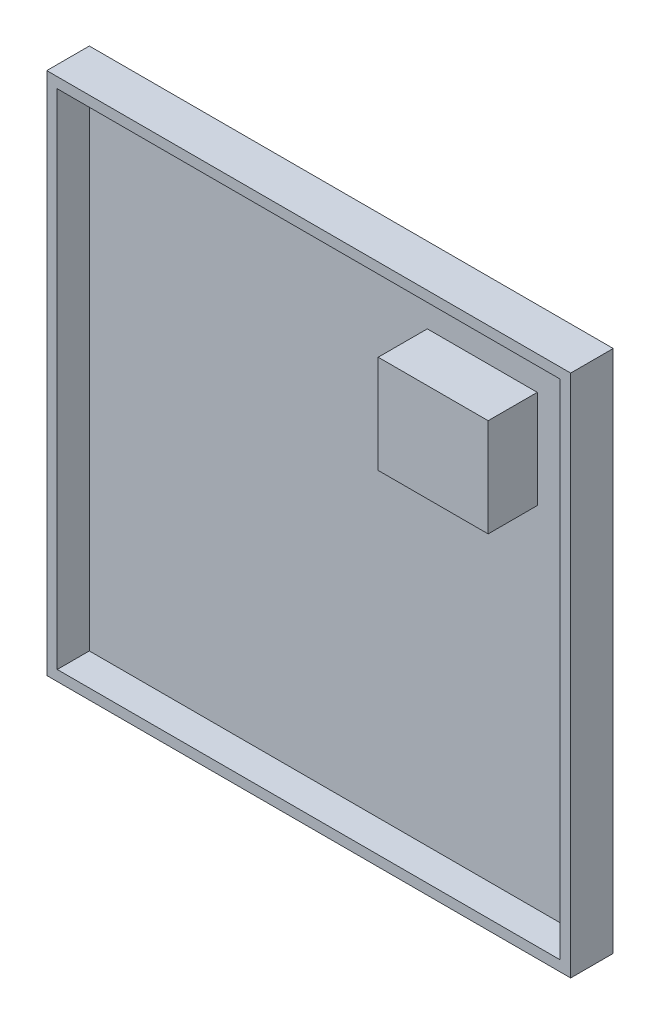
ISO-10303-21;
HEADER;
FILE_DESCRIPTION(('STEP AP214'),'2;1');
FILE_NAME('part.step','',(''),(''),'','','');
FILE_SCHEMA(('AUTOMOTIVE_DESIGN { 1 0 10303 214 1 1 1 1 }'));
ENDSEC;
DATA;
#1=APPLICATION_CONTEXT('core data for automotive mechanical design processes');
#2=APPLICATION_PROTOCOL_DEFINITION('international standard','automotive_design',2000,#1);
#3=PRODUCT_CONTEXT('',#1,'mechanical');
#4=PRODUCT('Part','Part','',(#3));
#5=PRODUCT_RELATED_PRODUCT_CATEGORY('part','',(#4));
#6=PRODUCT_DEFINITION_FORMATION('','',#4);
#7=PRODUCT_DEFINITION_CONTEXT('part definition',#1,'design');
#8=PRODUCT_DEFINITION('design','',#6,#7);
#9=PRODUCT_DEFINITION_SHAPE('','',#8);
#10=(LENGTH_UNIT() NAMED_UNIT(*) SI_UNIT(.MILLI.,.METRE.));
#11=(NAMED_UNIT(*) PLANE_ANGLE_UNIT() SI_UNIT($,.RADIAN.));
#12=(NAMED_UNIT(*) SI_UNIT($,.STERADIAN.) SOLID_ANGLE_UNIT());
#13=UNCERTAINTY_MEASURE_WITH_UNIT(LENGTH_MEASURE(1.E-05),#10,'distance_accuracy_value','');
#14=(GEOMETRIC_REPRESENTATION_CONTEXT(3) GLOBAL_UNCERTAINTY_ASSIGNED_CONTEXT((#13)) GLOBAL_UNIT_ASSIGNED_CONTEXT((#10,
#11,#12)) REPRESENTATION_CONTEXT('',''));
#15=CARTESIAN_POINT('',(0.,0.,0.));
#16=DIRECTION('',(0.,0.,1.));
#17=DIRECTION('',(1.,0.,0.));
#18=AXIS2_PLACEMENT_3D('',#15,#16,#17);
#19=CARTESIAN_POINT('',(0.,0.,2.032));
#20=DIRECTION('',(0.,0.,-1.));
#21=DIRECTION('',(-1.,0.,0.));
#22=AXIS2_PLACEMENT_3D('',#19,#20,#21);
#23=PLANE('',#22);
#24=DIRECTION('',(0.,1.,0.));
#25=VECTOR('',#24,1.);
#26=CARTESIAN_POINT('',(48.768,-48.768,2.03200000000001));
#27=LINE('',#26,#25);
#28=CARTESIAN_POINT('',(48.768,-48.768,2.03200000000001));
#29=VERTEX_POINT('',#28);
#30=CARTESIAN_POINT('',(48.768,48.768,2.03200000000001));
#31=VERTEX_POINT('',#30);
#32=EDGE_CURVE('E229',#29,#31,#27,.T.);
#33=ORIENTED_EDGE('',*,*,#32,.T.);
#34=DIRECTION('',(-1.,0.,0.));
#35=VECTOR('',#34,1.);
#36=CARTESIAN_POINT('',(-48.768,48.768,2.03200000000001));
#37=LINE('',#36,#35);
#38=CARTESIAN_POINT('',(-48.768,48.768,2.03200000000001));
#39=VERTEX_POINT('',#38);
#40=EDGE_CURVE('E217',#31,#39,#37,.T.);
#41=ORIENTED_EDGE('',*,*,#40,.T.);
#42=DIRECTION('',(0.,-1.,0.));
#43=VECTOR('',#42,1.);
#44=CARTESIAN_POINT('',(-48.768,-48.768,2.03200000000001));
#45=LINE('',#44,#43);
#46=CARTESIAN_POINT('',(-48.768,-48.768,2.03200000000001));
#47=VERTEX_POINT('',#46);
#48=EDGE_CURVE('E238',#39,#47,#45,.T.);
#49=ORIENTED_EDGE('',*,*,#48,.T.);
#50=DIRECTION('',(1.,0.,0.));
#51=VECTOR('',#50,1.);
#52=CARTESIAN_POINT('',(-48.768,-48.768,2.03200000000001));
#53=LINE('',#52,#51);
#54=EDGE_CURVE('E234',#47,#29,#53,.T.);
#55=ORIENTED_EDGE('',*,*,#54,.T.);
#56=EDGE_LOOP('',(#33,#41,#49,#55));
#57=FACE_BOUND('',#56,.T.);
#58=DIRECTION('',(0.,1.,0.));
#59=VECTOR('',#58,1.);
#60=CARTESIAN_POINT('',(38.1,19.0836276958304,2.032));
#61=LINE('',#60,#59);
#62=CARTESIAN_POINT('',(38.1,19.0836276958304,2.032));
#63=VERTEX_POINT('',#62);
#64=CARTESIAN_POINT('',(38.1,38.1,2.032));
#65=VERTEX_POINT('',#64);
#66=EDGE_CURVE('E183',#63,#65,#61,.T.);
#67=ORIENTED_EDGE('',*,*,#66,.F.);
#68=DIRECTION('',(1.,0.,0.));
#69=VECTOR('',#68,1.);
#70=CARTESIAN_POINT('',(16.7786128710826,19.0836276958304,2.032));
#71=LINE('',#70,#69);
#72=CARTESIAN_POINT('',(16.7786128710826,19.0836276958304,2.032));
#73=VERTEX_POINT('',#72);
#74=EDGE_CURVE('E189',#73,#63,#71,.T.);
#75=ORIENTED_EDGE('',*,*,#74,.F.);
#76=DIRECTION('',(0.,-1.,0.));
#77=VECTOR('',#76,1.);
#78=CARTESIAN_POINT('',(16.7786128710826,19.0836276958304,2.032));
#79=LINE('',#78,#77);
#80=CARTESIAN_POINT('',(16.7786128710826,38.1,2.032));
#81=VERTEX_POINT('',#80);
#82=EDGE_CURVE('E199',#81,#73,#79,.T.);
#83=ORIENTED_EDGE('',*,*,#82,.F.);
#84=DIRECTION('',(-1.,0.,0.));
#85=VECTOR('',#84,1.);
#86=CARTESIAN_POINT('',(16.7786128710826,38.1,2.032));
#87=LINE('',#86,#85);
#88=EDGE_CURVE('E59',#65,#81,#87,.T.);
#89=ORIENTED_EDGE('',*,*,#88,.F.);
#90=EDGE_LOOP('',(#67,#75,#83,#89));
#91=FACE_BOUND('',#90,.T.);
#92=ADVANCED_FACE('F36',(#57,#91),#23,.F.);
#93=CARTESIAN_POINT('',(50.8,-50.8,8.255));
#94=DIRECTION('',(-1.,0.,0.));
#95=DIRECTION('',(0.,0.,1.));
#96=AXIS2_PLACEMENT_3D('',#93,#94,#95);
#97=PLANE('',#96);
#98=DIRECTION('',(0.,1.,0.));
#99=VECTOR('',#98,1.);
#100=CARTESIAN_POINT('',(50.8,-50.8,0.));
#101=LINE('',#100,#99);
#102=CARTESIAN_POINT('',(50.8,-50.8,0.));
#103=VERTEX_POINT('',#102);
#104=CARTESIAN_POINT('',(50.8,50.8,0.));
#105=VERTEX_POINT('',#104);
#106=EDGE_CURVE('E246',#103,#105,#101,.T.);
#107=ORIENTED_EDGE('',*,*,#106,.T.);
#108=DIRECTION('',(0.,0.,-1.));
#109=VECTOR('',#108,1.);
#110=CARTESIAN_POINT('',(50.8,50.8,8.255));
#111=LINE('',#110,#109);
#112=CARTESIAN_POINT('',(50.8,50.8,8.255));
#113=VERTEX_POINT('',#112);
#114=EDGE_CURVE('E12',#113,#105,#111,.T.);
#115=ORIENTED_EDGE('',*,*,#114,.F.);
#116=DIRECTION('',(0.,1.,0.));
#117=VECTOR('',#116,1.);
#118=CARTESIAN_POINT('',(50.8,-50.8,8.255));
#119=LINE('',#118,#117);
#120=CARTESIAN_POINT('',(50.8,-50.8,8.255));
#121=VERTEX_POINT('',#120);
#122=EDGE_CURVE('E247',#121,#113,#119,.T.);
#123=ORIENTED_EDGE('',*,*,#122,.F.);
#124=DIRECTION('',(0.,0.,-1.));
#125=VECTOR('',#124,1.);
#126=CARTESIAN_POINT('',(50.8,-50.8,8.255));
#127=LINE('',#126,#125);
#128=EDGE_CURVE('E257',#121,#103,#127,.T.);
#129=ORIENTED_EDGE('',*,*,#128,.T.);
#130=EDGE_LOOP('',(#107,#115,#123,#129));
#131=FACE_BOUND('',#130,.T.);
#132=ADVANCED_FACE('F38',(#131),#97,.F.);
#133=CARTESIAN_POINT('',(-50.8,50.8,8.255));
#134=DIRECTION('',(0.,-1.,0.));
#135=DIRECTION('',(0.,0.,-1.));
#136=AXIS2_PLACEMENT_3D('',#133,#134,#135);
#137=PLANE('',#136);
#138=DIRECTION('',(-1.,0.,0.));
#139=VECTOR('',#138,1.);
#140=CARTESIAN_POINT('',(-50.8,50.8,0.));
#141=LINE('',#140,#139);
#142=CARTESIAN_POINT('',(-50.8,50.8,0.));
#143=VERTEX_POINT('',#142);
#144=EDGE_CURVE('E260',#105,#143,#141,.T.);
#145=ORIENTED_EDGE('',*,*,#144,.T.);
#146=DIRECTION('',(0.,0.,-1.));
#147=VECTOR('',#146,1.);
#148=CARTESIAN_POINT('',(-50.8,50.8,8.255));
#149=LINE('',#148,#147);
#150=CARTESIAN_POINT('',(-50.8,50.8,8.255));
#151=VERTEX_POINT('',#150);
#152=EDGE_CURVE('E44',#151,#143,#149,.T.);
#153=ORIENTED_EDGE('',*,*,#152,.F.);
#154=DIRECTION('',(-1.,0.,0.));
#155=VECTOR('',#154,1.);
#156=CARTESIAN_POINT('',(-50.8,50.8,8.255));
#157=LINE('',#156,#155);
#158=EDGE_CURVE('E250',#113,#151,#157,.T.);
#159=ORIENTED_EDGE('',*,*,#158,.F.);
#160=ORIENTED_EDGE('',*,*,#114,.T.);
#161=EDGE_LOOP('',(#145,#153,#159,#160));
#162=FACE_BOUND('',#161,.T.);
#163=ADVANCED_FACE('F288',(#162),#137,.F.);
#164=CARTESIAN_POINT('',(-50.8,-50.8,8.255));
#165=DIRECTION('',(1.,0.,0.));
#166=DIRECTION('',(0.,0.,-1.));
#167=AXIS2_PLACEMENT_3D('',#164,#165,#166);
#168=PLANE('',#167);
#169=DIRECTION('',(0.,-1.,0.));
#170=VECTOR('',#169,1.);
#171=CARTESIAN_POINT('',(-50.8,-50.8,0.));
#172=LINE('',#171,#170);
#173=CARTESIAN_POINT('',(-50.8,-50.8,0.));
#174=VERTEX_POINT('',#173);
#175=EDGE_CURVE('E262',#143,#174,#172,.T.);
#176=ORIENTED_EDGE('',*,*,#175,.T.);
#177=DIRECTION('',(0.,0.,-1.));
#178=VECTOR('',#177,1.);
#179=CARTESIAN_POINT('',(-50.8,-50.8,8.255));
#180=LINE('',#179,#178);
#181=CARTESIAN_POINT('',(-50.8,-50.8,8.255));
#182=VERTEX_POINT('',#181);
#183=EDGE_CURVE('E267',#182,#174,#180,.T.);
#184=ORIENTED_EDGE('',*,*,#183,.F.);
#185=DIRECTION('',(0.,-1.,0.));
#186=VECTOR('',#185,1.);
#187=CARTESIAN_POINT('',(-50.8,-50.8,8.255));
#188=LINE('',#187,#186);
#189=EDGE_CURVE('E253',#151,#182,#188,.T.);
#190=ORIENTED_EDGE('',*,*,#189,.F.);
#191=ORIENTED_EDGE('',*,*,#152,.T.);
#192=EDGE_LOOP('',(#176,#184,#190,#191));
#193=FACE_BOUND('',#192,.T.);
#194=ADVANCED_FACE('F274',(#193),#168,.F.);
#195=CARTESIAN_POINT('',(-50.8,-50.8,8.255));
#196=DIRECTION('',(0.,1.,0.));
#197=DIRECTION('',(0.,0.,1.));
#198=AXIS2_PLACEMENT_3D('',#195,#196,#197);
#199=PLANE('',#198);
#200=DIRECTION('',(1.,0.,0.));
#201=VECTOR('',#200,1.);
#202=CARTESIAN_POINT('',(-50.8,-50.8,0.));
#203=LINE('',#202,#201);
#204=EDGE_CURVE('E251',#174,#103,#203,.T.);
#205=ORIENTED_EDGE('',*,*,#204,.T.);
#206=ORIENTED_EDGE('',*,*,#128,.F.);
#207=DIRECTION('',(1.,0.,0.));
#208=VECTOR('',#207,1.);
#209=CARTESIAN_POINT('',(-50.8,-50.8,8.255));
#210=LINE('',#209,#208);
#211=EDGE_CURVE('E255',#182,#121,#210,.T.);
#212=ORIENTED_EDGE('',*,*,#211,.F.);
#213=ORIENTED_EDGE('',*,*,#183,.T.);
#214=EDGE_LOOP('',(#205,#206,#212,#213));
#215=FACE_BOUND('',#214,.T.);
#216=ADVANCED_FACE('F281',(#215),#199,.F.);
#217=CARTESIAN_POINT('',(0.,0.,8.255));
#218=DIRECTION('',(0.,0.,-1.));
#219=DIRECTION('',(-1.,0.,0.));
#220=AXIS2_PLACEMENT_3D('',#217,#218,#219);
#221=PLANE('',#220);
#222=DIRECTION('',(0.,-1.,0.));
#223=VECTOR('',#222,1.);
#224=CARTESIAN_POINT('',(-48.768,-48.768,8.255));
#225=LINE('',#224,#223);
#226=CARTESIAN_POINT('',(-48.768,48.768,8.255));
#227=VERTEX_POINT('',#226);
#228=CARTESIAN_POINT('',(-48.768,-48.768,8.255));
#229=VERTEX_POINT('',#228);
#230=EDGE_CURVE('E218',#227,#229,#225,.T.);
#231=ORIENTED_EDGE('',*,*,#230,.F.);
#232=DIRECTION('',(-1.,0.,0.));
#233=VECTOR('',#232,1.);
#234=CARTESIAN_POINT('',(-48.768,48.768,8.255));
#235=LINE('',#234,#233);
#236=CARTESIAN_POINT('',(48.768,48.768,8.255));
#237=VERTEX_POINT('',#236);
#238=EDGE_CURVE('E221',#237,#227,#235,.T.);
#239=ORIENTED_EDGE('',*,*,#238,.F.);
#240=DIRECTION('',(0.,1.,0.));
#241=VECTOR('',#240,1.);
#242=CARTESIAN_POINT('',(48.768,-48.768,8.255));
#243=LINE('',#242,#241);
#244=CARTESIAN_POINT('',(48.768,-48.768,8.255));
#245=VERTEX_POINT('',#244);
#246=EDGE_CURVE('E214',#245,#237,#243,.T.);
#247=ORIENTED_EDGE('',*,*,#246,.F.);
#248=DIRECTION('',(1.,0.,0.));
#249=VECTOR('',#248,1.);
#250=CARTESIAN_POINT('',(-48.768,-48.768,8.255));
#251=LINE('',#250,#249);
#252=EDGE_CURVE('E215',#229,#245,#251,.T.);
#253=ORIENTED_EDGE('',*,*,#252,.F.);
#254=EDGE_LOOP('',(#231,#239,#247,#253));
#255=FACE_BOUND('',#254,.T.);
#256=ORIENTED_EDGE('',*,*,#122,.T.);
#257=ORIENTED_EDGE('',*,*,#158,.T.);
#258=ORIENTED_EDGE('',*,*,#189,.T.);
#259=ORIENTED_EDGE('',*,*,#211,.T.);
#260=EDGE_LOOP('',(#256,#257,#258,#259));
#261=FACE_BOUND('',#260,.T.);
#262=ADVANCED_FACE('F287',(#255,#261),#221,.F.);
#263=CARTESIAN_POINT('',(0.,0.,0.));
#264=DIRECTION('',(0.,0.,-1.));
#265=DIRECTION('',(-1.,0.,0.));
#266=AXIS2_PLACEMENT_3D('',#263,#264,#265);
#267=PLANE('',#266);
#268=DIRECTION('',(0.,1.,0.));
#269=VECTOR('',#268,1.);
#270=CARTESIAN_POINT('',(18.8106128710826,21.1156276958304,0.));
#271=LINE('',#270,#269);
#272=CARTESIAN_POINT('',(18.8106128710826,21.1156276958304,0.));
#273=VERTEX_POINT('',#272);
#274=CARTESIAN_POINT('',(18.8106128710826,36.068,0.));
#275=VERTEX_POINT('',#274);
#276=EDGE_CURVE('E51',#273,#275,#271,.T.);
#277=ORIENTED_EDGE('',*,*,#276,.F.);
#278=DIRECTION('',(-1.,0.,0.));
#279=VECTOR('',#278,1.);
#280=CARTESIAN_POINT('',(18.8106128710826,21.1156276958304,0.));
#281=LINE('',#280,#279);
#282=CARTESIAN_POINT('',(36.068,21.1156276958304,0.));
#283=VERTEX_POINT('',#282);
#284=EDGE_CURVE('E172',#283,#273,#281,.T.);
#285=ORIENTED_EDGE('',*,*,#284,.F.);
#286=DIRECTION('',(0.,-1.,0.));
#287=VECTOR('',#286,1.);
#288=CARTESIAN_POINT('',(36.068,21.1156276958304,0.));
#289=LINE('',#288,#287);
#290=CARTESIAN_POINT('',(36.068,36.068,0.));
#291=VERTEX_POINT('',#290);
#292=EDGE_CURVE('E155',#291,#283,#289,.T.);
#293=ORIENTED_EDGE('',*,*,#292,.F.);
#294=DIRECTION('',(1.,0.,0.));
#295=VECTOR('',#294,1.);
#296=CARTESIAN_POINT('',(18.8106128710826,36.068,0.));
#297=LINE('',#296,#295);
#298=EDGE_CURVE('E165',#275,#291,#297,.T.);
#299=ORIENTED_EDGE('',*,*,#298,.F.);
#300=EDGE_LOOP('',(#277,#285,#293,#299));
#301=FACE_BOUND('',#300,.T.);
#302=ORIENTED_EDGE('',*,*,#106,.F.);
#303=ORIENTED_EDGE('',*,*,#204,.F.);
#304=ORIENTED_EDGE('',*,*,#175,.F.);
#305=ORIENTED_EDGE('',*,*,#144,.F.);
#306=EDGE_LOOP('',(#302,#303,#304,#305));
#307=FACE_BOUND('',#306,.T.);
#308=ADVANCED_FACE('F169',(#301,#307),#267,.T.);
#309=CARTESIAN_POINT('',(-48.768,48.768,-137.936734019622));
#310=DIRECTION('',(0.,1.,0.));
#311=DIRECTION('',(0.,0.,1.));
#312=AXIS2_PLACEMENT_3D('',#309,#310,#311);
#313=PLANE('',#312);
#314=DIRECTION('',(0.,0.,1.));
#315=VECTOR('',#314,1.);
#316=CARTESIAN_POINT('',(48.768,48.768,-137.936734019622));
#317=LINE('',#316,#315);
#318=EDGE_CURVE('E232',#31,#237,#317,.T.);
#319=ORIENTED_EDGE('',*,*,#318,.T.);
#320=ORIENTED_EDGE('',*,*,#238,.T.);
#321=DIRECTION('',(0.,0.,1.));
#322=VECTOR('',#321,1.);
#323=CARTESIAN_POINT('',(-48.768,48.768,-137.936734019622));
#324=LINE('',#323,#322);
#325=EDGE_CURVE('E228',#39,#227,#324,.T.);
#326=ORIENTED_EDGE('',*,*,#325,.F.);
#327=ORIENTED_EDGE('',*,*,#40,.F.);
#328=EDGE_LOOP('',(#319,#320,#326,#327));
#329=FACE_BOUND('',#328,.T.);
#330=ADVANCED_FACE('F302',(#329),#313,.F.);
#331=CARTESIAN_POINT('',(-48.768,-48.768,-137.936734019622));
#332=DIRECTION('',(-1.,0.,0.));
#333=DIRECTION('',(0.,0.,1.));
#334=AXIS2_PLACEMENT_3D('',#331,#332,#333);
#335=PLANE('',#334);
#336=ORIENTED_EDGE('',*,*,#325,.T.);
#337=ORIENTED_EDGE('',*,*,#230,.T.);
#338=DIRECTION('',(0.,0.,1.));
#339=VECTOR('',#338,1.);
#340=CARTESIAN_POINT('',(-48.768,-48.768,-137.936734019622));
#341=LINE('',#340,#339);
#342=EDGE_CURVE('E237',#47,#229,#341,.T.);
#343=ORIENTED_EDGE('',*,*,#342,.F.);
#344=ORIENTED_EDGE('',*,*,#48,.F.);
#345=EDGE_LOOP('',(#336,#337,#343,#344));
#346=FACE_BOUND('',#345,.T.);
#347=ADVANCED_FACE('F330',(#346),#335,.F.);
#348=CARTESIAN_POINT('',(-48.768,-48.768,-137.936734019622));
#349=DIRECTION('',(0.,-1.,0.));
#350=DIRECTION('',(0.,0.,-1.));
#351=AXIS2_PLACEMENT_3D('',#348,#349,#350);
#352=PLANE('',#351);
#353=ORIENTED_EDGE('',*,*,#342,.T.);
#354=ORIENTED_EDGE('',*,*,#252,.T.);
#355=DIRECTION('',(0.,0.,1.));
#356=VECTOR('',#355,1.);
#357=CARTESIAN_POINT('',(48.768,-48.768,-137.936734019622));
#358=LINE('',#357,#356);
#359=EDGE_CURVE('E233',#29,#245,#358,.T.);
#360=ORIENTED_EDGE('',*,*,#359,.F.);
#361=ORIENTED_EDGE('',*,*,#54,.F.);
#362=EDGE_LOOP('',(#353,#354,#360,#361));
#363=FACE_BOUND('',#362,.T.);
#364=ADVANCED_FACE('F337',(#363),#352,.F.);
#365=CARTESIAN_POINT('',(48.768,-48.768,-137.936734019622));
#366=DIRECTION('',(1.,0.,0.));
#367=DIRECTION('',(0.,0.,-1.));
#368=AXIS2_PLACEMENT_3D('',#365,#366,#367);
#369=PLANE('',#368);
#370=ORIENTED_EDGE('',*,*,#359,.T.);
#371=ORIENTED_EDGE('',*,*,#246,.T.);
#372=ORIENTED_EDGE('',*,*,#318,.F.);
#373=ORIENTED_EDGE('',*,*,#32,.F.);
#374=EDGE_LOOP('',(#370,#371,#372,#373));
#375=FACE_BOUND('',#374,.T.);
#376=ADVANCED_FACE('F344',(#375),#369,.F.);
#377=CARTESIAN_POINT('',(38.1,19.0836276958304,11.557));
#378=DIRECTION('',(-1.,0.,0.));
#379=DIRECTION('',(0.,0.,1.));
#380=AXIS2_PLACEMENT_3D('',#377,#378,#379);
#381=PLANE('',#380);
#382=ORIENTED_EDGE('',*,*,#66,.T.);
#383=DIRECTION('',(0.,0.,-1.));
#384=VECTOR('',#383,1.);
#385=CARTESIAN_POINT('',(38.1,38.1,11.557));
#386=LINE('',#385,#384);
#387=CARTESIAN_POINT('',(38.1,38.1,11.557));
#388=VERTEX_POINT('',#387);
#389=EDGE_CURVE('E212',#388,#65,#386,.T.);
#390=ORIENTED_EDGE('',*,*,#389,.F.);
#391=DIRECTION('',(0.,1.,0.));
#392=VECTOR('',#391,1.);
#393=CARTESIAN_POINT('',(38.1,19.0836276958304,11.557));
#394=LINE('',#393,#392);
#395=CARTESIAN_POINT('',(38.1,19.0836276958304,11.557));
#396=VERTEX_POINT('',#395);
#397=EDGE_CURVE('E185',#396,#388,#394,.T.);
#398=ORIENTED_EDGE('',*,*,#397,.F.);
#399=DIRECTION('',(0.,0.,-1.));
#400=VECTOR('',#399,1.);
#401=CARTESIAN_POINT('',(38.1,19.0836276958304,11.557));
#402=LINE('',#401,#400);
#403=EDGE_CURVE('E195',#396,#63,#402,.T.);
#404=ORIENTED_EDGE('',*,*,#403,.T.);
#405=EDGE_LOOP('',(#382,#390,#398,#404));
#406=FACE_BOUND('',#405,.T.);
#407=ADVANCED_FACE('F352',(#406),#381,.F.);
#408=CARTESIAN_POINT('',(16.7786128710826,38.1,11.557));
#409=DIRECTION('',(0.,-1.,0.));
#410=DIRECTION('',(0.,0.,-1.));
#411=AXIS2_PLACEMENT_3D('',#408,#409,#410);
#412=PLANE('',#411);
#413=ORIENTED_EDGE('',*,*,#88,.T.);
#414=DIRECTION('',(0.,0.,-1.));
#415=VECTOR('',#414,1.);
#416=CARTESIAN_POINT('',(16.7786128710826,38.1,11.557));
#417=LINE('',#416,#415);
#418=CARTESIAN_POINT('',(16.7786128710826,38.1,11.557));
#419=VERTEX_POINT('',#418);
#420=EDGE_CURVE('E209',#419,#81,#417,.T.);
#421=ORIENTED_EDGE('',*,*,#420,.F.);
#422=DIRECTION('',(-1.,0.,0.));
#423=VECTOR('',#422,1.);
#424=CARTESIAN_POINT('',(16.7786128710826,38.1,11.557));
#425=LINE('',#424,#423);
#426=EDGE_CURVE('E188',#388,#419,#425,.T.);
#427=ORIENTED_EDGE('',*,*,#426,.F.);
#428=ORIENTED_EDGE('',*,*,#389,.T.);
#429=EDGE_LOOP('',(#413,#421,#427,#428));
#430=FACE_BOUND('',#429,.T.);
#431=ADVANCED_FACE('F360',(#430),#412,.F.);
#432=CARTESIAN_POINT('',(16.7786128710826,19.0836276958304,11.557));
#433=DIRECTION('',(1.,0.,0.));
#434=DIRECTION('',(0.,0.,-1.));
#435=AXIS2_PLACEMENT_3D('',#432,#433,#434);
#436=PLANE('',#435);
#437=ORIENTED_EDGE('',*,*,#82,.T.);
#438=DIRECTION('',(0.,0.,-1.));
#439=VECTOR('',#438,1.);
#440=CARTESIAN_POINT('',(16.7786128710826,19.0836276958304,11.557));
#441=LINE('',#440,#439);
#442=CARTESIAN_POINT('',(16.7786128710826,19.0836276958304,11.557));
#443=VERTEX_POINT('',#442);
#444=EDGE_CURVE('E206',#443,#73,#441,.T.);
#445=ORIENTED_EDGE('',*,*,#444,.F.);
#446=DIRECTION('',(0.,-1.,0.));
#447=VECTOR('',#446,1.);
#448=CARTESIAN_POINT('',(16.7786128710826,19.0836276958304,11.557));
#449=LINE('',#448,#447);
#450=EDGE_CURVE('E191',#419,#443,#449,.T.);
#451=ORIENTED_EDGE('',*,*,#450,.F.);
#452=ORIENTED_EDGE('',*,*,#420,.T.);
#453=EDGE_LOOP('',(#437,#445,#451,#452));
#454=FACE_BOUND('',#453,.T.);
#455=ADVANCED_FACE('F368',(#454),#436,.F.);
#456=CARTESIAN_POINT('',(16.7786128710826,19.0836276958304,11.557));
#457=DIRECTION('',(0.,1.,0.));
#458=DIRECTION('',(0.,0.,1.));
#459=AXIS2_PLACEMENT_3D('',#456,#457,#458);
#460=PLANE('',#459);
#461=ORIENTED_EDGE('',*,*,#74,.T.);
#462=ORIENTED_EDGE('',*,*,#403,.F.);
#463=DIRECTION('',(1.,0.,0.));
#464=VECTOR('',#463,1.);
#465=CARTESIAN_POINT('',(16.7786128710826,19.0836276958304,11.557));
#466=LINE('',#465,#464);
#467=EDGE_CURVE('E193',#443,#396,#466,.T.);
#468=ORIENTED_EDGE('',*,*,#467,.F.);
#469=ORIENTED_EDGE('',*,*,#444,.T.);
#470=EDGE_LOOP('',(#461,#462,#468,#469));
#471=FACE_BOUND('',#470,.T.);
#472=ADVANCED_FACE('F376',(#471),#460,.F.);
#473=CARTESIAN_POINT('',(0.,0.,11.557));
#474=DIRECTION('',(0.,0.,-1.));
#475=DIRECTION('',(-1.,0.,0.));
#476=AXIS2_PLACEMENT_3D('',#473,#474,#475);
#477=PLANE('',#476);
#478=ORIENTED_EDGE('',*,*,#397,.T.);
#479=ORIENTED_EDGE('',*,*,#426,.T.);
#480=ORIENTED_EDGE('',*,*,#450,.T.);
#481=ORIENTED_EDGE('',*,*,#467,.T.);
#482=EDGE_LOOP('',(#478,#479,#480,#481));
#483=FACE_BOUND('',#482,.T.);
#484=ADVANCED_FACE('F384',(#483),#477,.F.);
#485=CARTESIAN_POINT('',(18.8106128710826,21.1156276958304,34.3909844976697));
#486=DIRECTION('',(-1.,0.,0.));
#487=DIRECTION('',(0.,-1.,0.));
#488=AXIS2_PLACEMENT_3D('',#485,#486,#487);
#489=PLANE('',#488);
#490=DIRECTION('',(0.,-1.,0.));
#491=VECTOR('',#490,1.);
#492=CARTESIAN_POINT('',(18.8106128710826,21.1156276958304,9.525));
#493=LINE('',#492,#491);
#494=CARTESIAN_POINT('',(18.8106128710826,36.068,9.525));
#495=VERTEX_POINT('',#494);
#496=CARTESIAN_POINT('',(18.8106128710826,21.1156276958304,9.525));
#497=VERTEX_POINT('',#496);
#498=EDGE_CURVE('E184',#495,#497,#493,.T.);
#499=ORIENTED_EDGE('',*,*,#498,.T.);
#500=DIRECTION('',(0.,0.,-1.));
#501=VECTOR('',#500,1.);
#502=CARTESIAN_POINT('',(18.8106128710826,21.1156276958304,34.3909844976697));
#503=LINE('',#502,#501);
#504=EDGE_CURVE('E177',#497,#273,#503,.T.);
#505=ORIENTED_EDGE('',*,*,#504,.T.);
#506=ORIENTED_EDGE('',*,*,#276,.T.);
#507=DIRECTION('',(0.,0.,-1.));
#508=VECTOR('',#507,1.);
#509=CARTESIAN_POINT('',(18.8106128710826,36.068,34.3909844976697));
#510=LINE('',#509,#508);
#511=EDGE_CURVE('E162',#495,#275,#510,.T.);
#512=ORIENTED_EDGE('',*,*,#511,.F.);
#513=EDGE_LOOP('',(#499,#505,#506,#512));
#514=FACE_BOUND('',#513,.T.);
#515=ADVANCED_FACE('F391',(#514),#489,.F.);
#516=CARTESIAN_POINT('',(18.8106128710826,21.1156276958304,34.3909844976697));
#517=DIRECTION('',(0.,-1.,0.));
#518=DIRECTION('',(1.,0.,0.));
#519=AXIS2_PLACEMENT_3D('',#516,#517,#518);
#520=PLANE('',#519);
#521=DIRECTION('',(1.,0.,0.));
#522=VECTOR('',#521,1.);
#523=CARTESIAN_POINT('',(18.8106128710826,21.1156276958304,9.525));
#524=LINE('',#523,#522);
#525=CARTESIAN_POINT('',(36.068,21.1156276958304,9.525));
#526=VERTEX_POINT('',#525);
#527=EDGE_CURVE('E482',#497,#526,#524,.T.);
#528=ORIENTED_EDGE('',*,*,#527,.T.);
#529=DIRECTION('',(0.,0.,-1.));
#530=VECTOR('',#529,1.);
#531=CARTESIAN_POINT('',(36.068,21.1156276958304,34.3909844976697));
#532=LINE('',#531,#530);
#533=EDGE_CURVE('E161',#526,#283,#532,.T.);
#534=ORIENTED_EDGE('',*,*,#533,.T.);
#535=ORIENTED_EDGE('',*,*,#284,.T.);
#536=ORIENTED_EDGE('',*,*,#504,.F.);
#537=EDGE_LOOP('',(#528,#534,#535,#536));
#538=FACE_BOUND('',#537,.T.);
#539=ADVANCED_FACE('F398',(#538),#520,.F.);
#540=CARTESIAN_POINT('',(36.068,21.1156276958304,34.3909844976697));
#541=DIRECTION('',(1.,0.,0.));
#542=DIRECTION('',(0.,1.,0.));
#543=AXIS2_PLACEMENT_3D('',#540,#541,#542);
#544=PLANE('',#543);
#545=DIRECTION('',(0.,1.,0.));
#546=VECTOR('',#545,1.);
#547=CARTESIAN_POINT('',(36.068,21.1156276958304,9.525));
#548=LINE('',#547,#546);
#549=CARTESIAN_POINT('',(36.068,36.068,9.525));
#550=VERTEX_POINT('',#549);
#551=EDGE_CURVE('E158',#526,#550,#548,.T.);
#552=ORIENTED_EDGE('',*,*,#551,.T.);
#553=DIRECTION('',(0.,0.,-1.));
#554=VECTOR('',#553,1.);
#555=CARTESIAN_POINT('',(36.068,36.068,34.3909844976697));
#556=LINE('',#555,#554);
#557=EDGE_CURVE('E150',#550,#291,#556,.T.);
#558=ORIENTED_EDGE('',*,*,#557,.T.);
#559=ORIENTED_EDGE('',*,*,#292,.T.);
#560=ORIENTED_EDGE('',*,*,#533,.F.);
#561=EDGE_LOOP('',(#552,#558,#559,#560));
#562=FACE_BOUND('',#561,.T.);
#563=ADVANCED_FACE('F152',(#562),#544,.F.);
#564=CARTESIAN_POINT('',(18.8106128710826,36.068,34.3909844976697));
#565=DIRECTION('',(0.,1.,0.));
#566=DIRECTION('',(0.,0.,1.));
#567=AXIS2_PLACEMENT_3D('',#564,#565,#566);
#568=PLANE('',#567);
#569=DIRECTION('',(-1.,0.,0.));
#570=VECTOR('',#569,1.);
#571=CARTESIAN_POINT('',(18.8106128710826,36.068,9.525));
#572=LINE('',#571,#570);
#573=EDGE_CURVE('E181',#550,#495,#572,.T.);
#574=ORIENTED_EDGE('',*,*,#573,.T.);
#575=ORIENTED_EDGE('',*,*,#511,.T.);
#576=ORIENTED_EDGE('',*,*,#298,.T.);
#577=ORIENTED_EDGE('',*,*,#557,.F.);
#578=EDGE_LOOP('',(#574,#575,#576,#577));
#579=FACE_BOUND('',#578,.T.);
#580=ADVANCED_FACE('F166',(#579),#568,.F.);
#581=CARTESIAN_POINT('',(0.,0.,9.525));
#582=DIRECTION('',(0.,0.,-1.));
#583=DIRECTION('',(-1.,0.,0.));
#584=AXIS2_PLACEMENT_3D('',#581,#582,#583);
#585=PLANE('',#584);
#586=ORIENTED_EDGE('',*,*,#498,.F.);
#587=ORIENTED_EDGE('',*,*,#573,.F.);
#588=ORIENTED_EDGE('',*,*,#551,.F.);
#589=ORIENTED_EDGE('',*,*,#527,.F.);
#590=EDGE_LOOP('',(#586,#587,#588,#589));
#591=FACE_BOUND('',#590,.T.);
#592=ADVANCED_FACE('F418',(#591),#585,.T.);
#593=CLOSED_SHELL('',(#92,#132,#163,#194,#216,#262,#308,#330,#347,#364,#376,#407,#431,#455,#472,
#484,#515,#539,#563,#580,#592));
#594=MANIFOLD_SOLID_BREP('B2',#593);
#595=ADVANCED_BREP_SHAPE_REPRESENTATION('',(#18,#594),#14);
#596=SHAPE_DEFINITION_REPRESENTATION(#9,#595);
ENDSEC;
END-ISO-10303-21;
